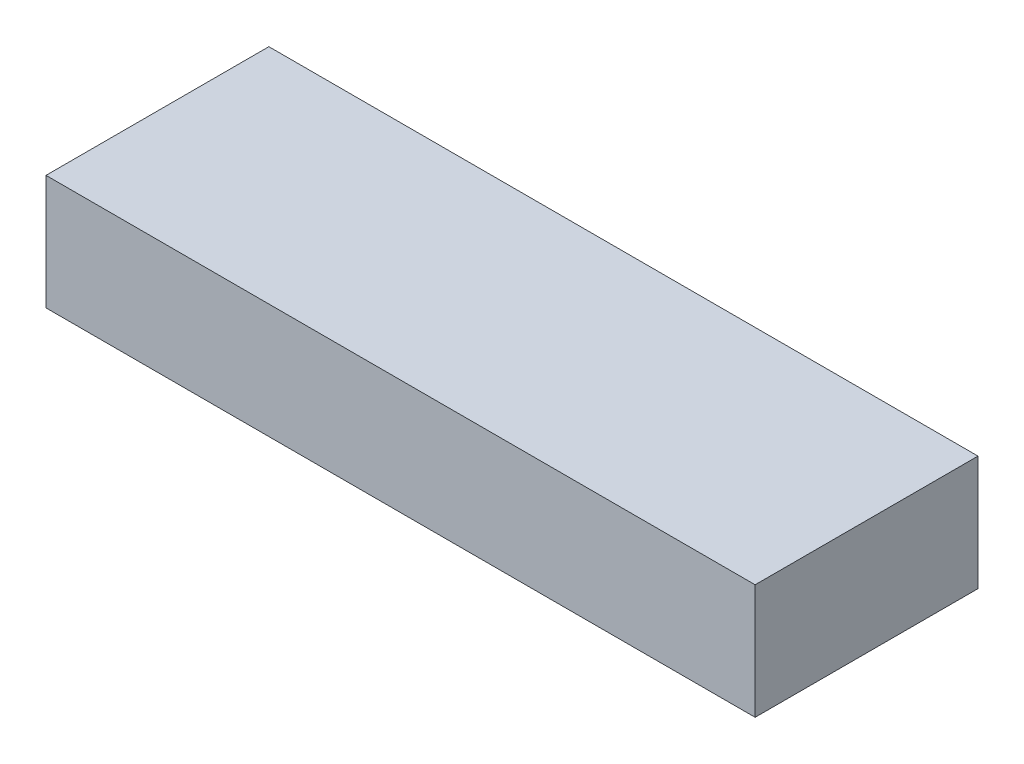
ISO-10303-21;
HEADER;
FILE_DESCRIPTION(('STEP AP214'),'2;1');
FILE_NAME('part.step','',(''),(''),'','','');
FILE_SCHEMA(('AUTOMOTIVE_DESIGN { 1 0 10303 214 1 1 1 1 }'));
ENDSEC;
DATA;
#1=APPLICATION_CONTEXT('core data for automotive mechanical design processes');
#2=APPLICATION_PROTOCOL_DEFINITION('international standard','automotive_design',2000,#1);
#3=PRODUCT_CONTEXT('',#1,'mechanical');
#4=PRODUCT('Part','Part','',(#3));
#5=PRODUCT_RELATED_PRODUCT_CATEGORY('part','',(#4));
#6=PRODUCT_DEFINITION_FORMATION('','',#4);
#7=PRODUCT_DEFINITION_CONTEXT('part definition',#1,'design');
#8=PRODUCT_DEFINITION('design','',#6,#7);
#9=PRODUCT_DEFINITION_SHAPE('','',#8);
#10=(LENGTH_UNIT() NAMED_UNIT(*) SI_UNIT(.MILLI.,.METRE.));
#11=(NAMED_UNIT(*) PLANE_ANGLE_UNIT() SI_UNIT($,.RADIAN.));
#12=(NAMED_UNIT(*) SI_UNIT($,.STERADIAN.) SOLID_ANGLE_UNIT());
#13=UNCERTAINTY_MEASURE_WITH_UNIT(LENGTH_MEASURE(1.E-05),#10,'distance_accuracy_value','');
#14=(GEOMETRIC_REPRESENTATION_CONTEXT(3) GLOBAL_UNCERTAINTY_ASSIGNED_CONTEXT((#13)) GLOBAL_UNIT_ASSIGNED_CONTEXT((#10,
#11,#12)) REPRESENTATION_CONTEXT('',''));
#15=CARTESIAN_POINT('',(0.,0.,0.));
#16=DIRECTION('',(0.,0.,1.));
#17=DIRECTION('',(1.,0.,0.));
#18=AXIS2_PLACEMENT_3D('',#15,#16,#17);
#19=CARTESIAN_POINT('',(52.5,17.,16.5));
#20=DIRECTION('',(-1.,0.,0.));
#21=DIRECTION('',(0.,0.,1.));
#22=AXIS2_PLACEMENT_3D('',#19,#20,#21);
#23=PLANE('',#22);
#24=DIRECTION('',(0.,0.,-1.));
#25=VECTOR('',#24,1.);
#26=CARTESIAN_POINT('',(52.5,0.,16.5));
#27=LINE('',#26,#25);
#28=CARTESIAN_POINT('',(52.5,0.,16.5));
#29=VERTEX_POINT('',#28);
#30=CARTESIAN_POINT('',(52.5,0.,-16.5));
#31=VERTEX_POINT('',#30);
#32=EDGE_CURVE('E97',#29,#31,#27,.T.);
#33=ORIENTED_EDGE('',*,*,#32,.T.);
#34=DIRECTION('',(0.,-1.,0.));
#35=VECTOR('',#34,1.);
#36=CARTESIAN_POINT('',(52.5,17.,-16.5));
#37=LINE('',#36,#35);
#38=CARTESIAN_POINT('',(52.5,17.,-16.5));
#39=VERTEX_POINT('',#38);
#40=EDGE_CURVE('E11',#39,#31,#37,.T.);
#41=ORIENTED_EDGE('',*,*,#40,.F.);
#42=DIRECTION('',(0.,0.,-1.));
#43=VECTOR('',#42,1.);
#44=CARTESIAN_POINT('',(52.5,17.,16.5));
#45=LINE('',#44,#43);
#46=CARTESIAN_POINT('',(52.5,17.,16.5));
#47=VERTEX_POINT('',#46);
#48=EDGE_CURVE('E85',#47,#39,#45,.T.);
#49=ORIENTED_EDGE('',*,*,#48,.F.);
#50=DIRECTION('',(0.,-1.,0.));
#51=VECTOR('',#50,1.);
#52=CARTESIAN_POINT('',(52.5,17.,16.5));
#53=LINE('',#52,#51);
#54=EDGE_CURVE('E93',#47,#29,#53,.T.);
#55=ORIENTED_EDGE('',*,*,#54,.T.);
#56=EDGE_LOOP('',(#33,#41,#49,#55));
#57=FACE_BOUND('',#56,.T.);
#58=ADVANCED_FACE('F34',(#57),#23,.F.);
#59=CARTESIAN_POINT('',(-52.5,17.,-16.5));
#60=DIRECTION('',(0.,0.,1.));
#61=DIRECTION('',(1.,0.,0.));
#62=AXIS2_PLACEMENT_3D('',#59,#60,#61);
#63=PLANE('',#62);
#64=DIRECTION('',(-1.,0.,0.));
#65=VECTOR('',#64,1.);
#66=CARTESIAN_POINT('',(-52.5,0.,-16.5));
#67=LINE('',#66,#65);
#68=CARTESIAN_POINT('',(-52.5,0.,-16.5));
#69=VERTEX_POINT('',#68);
#70=EDGE_CURVE('E89',#31,#69,#67,.T.);
#71=ORIENTED_EDGE('',*,*,#70,.T.);
#72=DIRECTION('',(0.,-1.,0.));
#73=VECTOR('',#72,1.);
#74=CARTESIAN_POINT('',(-52.5,17.,-16.5));
#75=LINE('',#74,#73);
#76=CARTESIAN_POINT('',(-52.5,17.,-16.5));
#77=VERTEX_POINT('',#76);
#78=EDGE_CURVE('E42',#77,#69,#75,.T.);
#79=ORIENTED_EDGE('',*,*,#78,.F.);
#80=DIRECTION('',(-1.,0.,0.));
#81=VECTOR('',#80,1.);
#82=CARTESIAN_POINT('',(-52.5,17.,-16.5));
#83=LINE('',#82,#81);
#84=EDGE_CURVE('E80',#39,#77,#83,.T.);
#85=ORIENTED_EDGE('',*,*,#84,.F.);
#86=ORIENTED_EDGE('',*,*,#40,.T.);
#87=EDGE_LOOP('',(#71,#79,#85,#86));
#88=FACE_BOUND('',#87,.T.);
#89=ADVANCED_FACE('F88',(#88),#63,.F.);
#90=CARTESIAN_POINT('',(-52.5,17.,16.5));
#91=DIRECTION('',(1.,0.,0.));
#92=DIRECTION('',(0.,0.,-1.));
#93=AXIS2_PLACEMENT_3D('',#90,#91,#92);
#94=PLANE('',#93);
#95=DIRECTION('',(0.,0.,1.));
#96=VECTOR('',#95,1.);
#97=CARTESIAN_POINT('',(-52.5,0.,16.5));
#98=LINE('',#97,#96);
#99=CARTESIAN_POINT('',(-52.5,0.,16.5));
#100=VERTEX_POINT('',#99);
#101=EDGE_CURVE('E67',#69,#100,#98,.T.);
#102=ORIENTED_EDGE('',*,*,#101,.T.);
#103=DIRECTION('',(0.,-1.,0.));
#104=VECTOR('',#103,1.);
#105=CARTESIAN_POINT('',(-52.5,17.,16.5));
#106=LINE('',#105,#104);
#107=CARTESIAN_POINT('',(-52.5,17.,16.5));
#108=VERTEX_POINT('',#107);
#109=EDGE_CURVE('E90',#108,#100,#106,.T.);
#110=ORIENTED_EDGE('',*,*,#109,.F.);
#111=DIRECTION('',(0.,0.,1.));
#112=VECTOR('',#111,1.);
#113=CARTESIAN_POINT('',(-52.5,17.,16.5));
#114=LINE('',#113,#112);
#115=EDGE_CURVE('E83',#77,#108,#114,.T.);
#116=ORIENTED_EDGE('',*,*,#115,.F.);
#117=ORIENTED_EDGE('',*,*,#78,.T.);
#118=EDGE_LOOP('',(#102,#110,#116,#117));
#119=FACE_BOUND('',#118,.T.);
#120=ADVANCED_FACE('F91',(#119),#94,.F.);
#121=CARTESIAN_POINT('',(-52.5,17.,16.5));
#122=DIRECTION('',(0.,0.,-1.));
#123=DIRECTION('',(-1.,0.,0.));
#124=AXIS2_PLACEMENT_3D('',#121,#122,#123);
#125=PLANE('',#124);
#126=DIRECTION('',(1.,0.,0.));
#127=VECTOR('',#126,1.);
#128=CARTESIAN_POINT('',(-52.5,0.,16.5));
#129=LINE('',#128,#127);
#130=EDGE_CURVE('E73',#100,#29,#129,.T.);
#131=ORIENTED_EDGE('',*,*,#130,.T.);
#132=ORIENTED_EDGE('',*,*,#54,.F.);
#133=DIRECTION('',(1.,0.,0.));
#134=VECTOR('',#133,1.);
#135=CARTESIAN_POINT('',(-52.5,17.,16.5));
#136=LINE('',#135,#134);
#137=EDGE_CURVE('E50',#108,#47,#136,.T.);
#138=ORIENTED_EDGE('',*,*,#137,.F.);
#139=ORIENTED_EDGE('',*,*,#109,.T.);
#140=EDGE_LOOP('',(#131,#132,#138,#139));
#141=FACE_BOUND('',#140,.T.);
#142=ADVANCED_FACE('F104',(#141),#125,.F.);
#143=CARTESIAN_POINT('',(0.,17.,0.));
#144=DIRECTION('',(0.,-1.,0.));
#145=DIRECTION('',(0.,0.,-1.));
#146=AXIS2_PLACEMENT_3D('',#143,#144,#145);
#147=PLANE('',#146);
#148=ORIENTED_EDGE('',*,*,#48,.T.);
#149=ORIENTED_EDGE('',*,*,#84,.T.);
#150=ORIENTED_EDGE('',*,*,#115,.T.);
#151=ORIENTED_EDGE('',*,*,#137,.T.);
#152=EDGE_LOOP('',(#148,#149,#150,#151));
#153=FACE_BOUND('',#152,.T.);
#154=ADVANCED_FACE('F81',(#153),#147,.F.);
#155=CARTESIAN_POINT('',(0.,0.,0.));
#156=DIRECTION('',(0.,-1.,0.));
#157=DIRECTION('',(0.,0.,-1.));
#158=AXIS2_PLACEMENT_3D('',#155,#156,#157);
#159=PLANE('',#158);
#160=ORIENTED_EDGE('',*,*,#32,.F.);
#161=ORIENTED_EDGE('',*,*,#130,.F.);
#162=ORIENTED_EDGE('',*,*,#101,.F.);
#163=ORIENTED_EDGE('',*,*,#70,.F.);
#164=EDGE_LOOP('',(#160,#161,#162,#163));
#165=FACE_BOUND('',#164,.T.);
#166=ADVANCED_FACE('F107',(#165),#159,.T.);
#167=CLOSED_SHELL('',(#58,#89,#120,#142,#154,#166));
#168=MANIFOLD_SOLID_BREP('B2',#167);
#169=ADVANCED_BREP_SHAPE_REPRESENTATION('',(#18,#168),#14);
#170=SHAPE_DEFINITION_REPRESENTATION(#9,#169);
ENDSEC;
END-ISO-10303-21;
